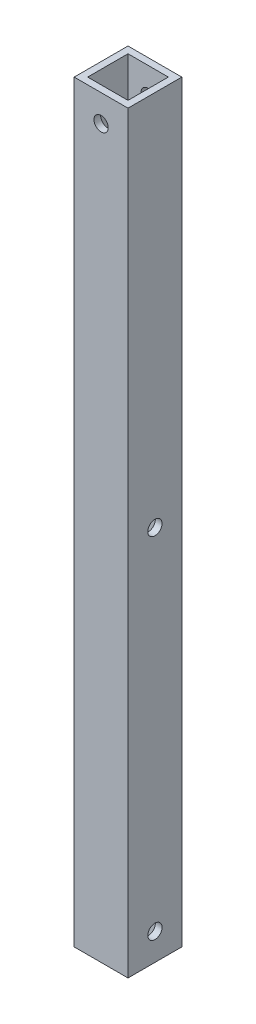
ISO-10303-21;
HEADER;
FILE_DESCRIPTION(('STEP AP214'),'2;1');
FILE_NAME('part.step','',(''),(''),'','','');
FILE_SCHEMA(('AUTOMOTIVE_DESIGN { 1 0 10303 214 1 1 1 1 }'));
ENDSEC;
DATA;
#1=APPLICATION_CONTEXT('core data for automotive mechanical design processes');
#2=APPLICATION_PROTOCOL_DEFINITION('international standard','automotive_design',2000,#1);
#3=PRODUCT_CONTEXT('',#1,'mechanical');
#4=PRODUCT('Part','Part','',(#3));
#5=PRODUCT_RELATED_PRODUCT_CATEGORY('part','',(#4));
#6=PRODUCT_DEFINITION_FORMATION('','',#4);
#7=PRODUCT_DEFINITION_CONTEXT('part definition',#1,'design');
#8=PRODUCT_DEFINITION('design','',#6,#7);
#9=PRODUCT_DEFINITION_SHAPE('','',#8);
#10=(LENGTH_UNIT() NAMED_UNIT(*) SI_UNIT(.MILLI.,.METRE.));
#11=(NAMED_UNIT(*) PLANE_ANGLE_UNIT() SI_UNIT($,.RADIAN.));
#12=(NAMED_UNIT(*) SI_UNIT($,.STERADIAN.) SOLID_ANGLE_UNIT());
#13=UNCERTAINTY_MEASURE_WITH_UNIT(LENGTH_MEASURE(1.E-05),#10,'distance_accuracy_value','');
#14=(GEOMETRIC_REPRESENTATION_CONTEXT(3) GLOBAL_UNCERTAINTY_ASSIGNED_CONTEXT((#13)) GLOBAL_UNIT_ASSIGNED_CONTEXT((#10,
#11,#12)) REPRESENTATION_CONTEXT('',''));
#15=CARTESIAN_POINT('',(0.,0.,0.));
#16=DIRECTION('',(0.,0.,1.));
#17=DIRECTION('',(1.,0.,0.));
#18=AXIS2_PLACEMENT_3D('',#15,#16,#17);
#19=CARTESIAN_POINT('',(0.,355.6,0.));
#20=DIRECTION('',(0.,-1.,0.));
#21=DIRECTION('',(0.,0.,-1.));
#22=AXIS2_PLACEMENT_3D('',#19,#20,#21);
#23=PLANE('',#22);
#24=DIRECTION('',(0.,0.,1.));
#25=VECTOR('',#24,1.);
#26=CARTESIAN_POINT('',(0.,355.6,0.));
#27=LINE('',#26,#25);
#28=CARTESIAN_POINT('',(0.,355.6,-25.4));
#29=VERTEX_POINT('',#28);
#30=CARTESIAN_POINT('',(0.,355.6,0.));
#31=VERTEX_POINT('',#30);
#32=EDGE_CURVE('E142',#29,#31,#27,.T.);
#33=ORIENTED_EDGE('',*,*,#32,.T.);
#34=DIRECTION('',(1.,0.,0.));
#35=VECTOR('',#34,1.);
#36=CARTESIAN_POINT('',(0.,355.6,0.));
#37=LINE('',#36,#35);
#38=CARTESIAN_POINT('',(25.4,355.6,0.));
#39=VERTEX_POINT('',#38);
#40=EDGE_CURVE('E145',#31,#39,#37,.T.);
#41=ORIENTED_EDGE('',*,*,#40,.T.);
#42=DIRECTION('',(0.,0.,-1.));
#43=VECTOR('',#42,1.);
#44=CARTESIAN_POINT('',(25.4,355.6,0.));
#45=LINE('',#44,#43);
#46=CARTESIAN_POINT('',(25.4,355.6,-25.4));
#47=VERTEX_POINT('',#46);
#48=EDGE_CURVE('E148',#39,#47,#45,.T.);
#49=ORIENTED_EDGE('',*,*,#48,.T.);
#50=DIRECTION('',(-1.,0.,0.));
#51=VECTOR('',#50,1.);
#52=CARTESIAN_POINT('',(0.,355.6,-25.4));
#53=LINE('',#52,#51);
#54=EDGE_CURVE('E150',#47,#29,#53,.T.);
#55=ORIENTED_EDGE('',*,*,#54,.T.);
#56=EDGE_LOOP('',(#33,#41,#49,#55));
#57=FACE_BOUND('',#56,.T.);
#58=DIRECTION('',(0.,0.,1.));
#59=VECTOR('',#58,1.);
#60=CARTESIAN_POINT('',(3.175,355.6,-3.175));
#61=LINE('',#60,#59);
#62=CARTESIAN_POINT('',(3.175,355.6,-22.225));
#63=VERTEX_POINT('',#62);
#64=CARTESIAN_POINT('',(3.175,355.6,-3.175));
#65=VERTEX_POINT('',#64);
#66=EDGE_CURVE('E104',#63,#65,#61,.T.);
#67=ORIENTED_EDGE('',*,*,#66,.F.);
#68=DIRECTION('',(-1.,0.,0.));
#69=VECTOR('',#68,1.);
#70=CARTESIAN_POINT('',(3.175,355.6,-22.225));
#71=LINE('',#70,#69);
#72=CARTESIAN_POINT('',(22.225,355.6,-22.225));
#73=VERTEX_POINT('',#72);
#74=EDGE_CURVE('E126',#73,#63,#71,.T.);
#75=ORIENTED_EDGE('',*,*,#74,.F.);
#76=DIRECTION('',(0.,0.,-1.));
#77=VECTOR('',#76,1.);
#78=CARTESIAN_POINT('',(22.225,355.6,-3.175));
#79=LINE('',#78,#77);
#80=CARTESIAN_POINT('',(22.225,355.6,-3.175));
#81=VERTEX_POINT('',#80);
#82=EDGE_CURVE('E124',#81,#73,#79,.T.);
#83=ORIENTED_EDGE('',*,*,#82,.F.);
#84=DIRECTION('',(1.,0.,0.));
#85=VECTOR('',#84,1.);
#86=CARTESIAN_POINT('',(3.175,355.6,-3.175));
#87=LINE('',#86,#85);
#88=EDGE_CURVE('E112',#65,#81,#87,.T.);
#89=ORIENTED_EDGE('',*,*,#88,.F.);
#90=EDGE_LOOP('',(#67,#75,#83,#89));
#91=FACE_BOUND('',#90,.T.);
#92=ADVANCED_FACE('F37',(#57,#91),#23,.F.);
#93=CARTESIAN_POINT('',(0.,0.,0.));
#94=DIRECTION('',(0.,-1.,0.));
#95=DIRECTION('',(0.,0.,-1.));
#96=AXIS2_PLACEMENT_3D('',#93,#94,#95);
#97=PLANE('',#96);
#98=DIRECTION('',(0.,0.,1.));
#99=VECTOR('',#98,1.);
#100=CARTESIAN_POINT('',(0.,0.,0.));
#101=LINE('',#100,#99);
#102=CARTESIAN_POINT('',(0.,0.,-25.4));
#103=VERTEX_POINT('',#102);
#104=CARTESIAN_POINT('',(0.,0.,0.));
#105=VERTEX_POINT('',#104);
#106=EDGE_CURVE('E120',#103,#105,#101,.T.);
#107=ORIENTED_EDGE('',*,*,#106,.F.);
#108=DIRECTION('',(-1.,0.,0.));
#109=VECTOR('',#108,1.);
#110=CARTESIAN_POINT('',(0.,0.,-25.4));
#111=LINE('',#110,#109);
#112=CARTESIAN_POINT('',(25.4,0.,-25.4));
#113=VERTEX_POINT('',#112);
#114=EDGE_CURVE('E146',#113,#103,#111,.T.);
#115=ORIENTED_EDGE('',*,*,#114,.F.);
#116=DIRECTION('',(0.,0.,-1.));
#117=VECTOR('',#116,1.);
#118=CARTESIAN_POINT('',(25.4,0.,0.));
#119=LINE('',#118,#117);
#120=CARTESIAN_POINT('',(25.4,0.,0.));
#121=VERTEX_POINT('',#120);
#122=EDGE_CURVE('E157',#121,#113,#119,.T.);
#123=ORIENTED_EDGE('',*,*,#122,.F.);
#124=DIRECTION('',(1.,0.,0.));
#125=VECTOR('',#124,1.);
#126=CARTESIAN_POINT('',(0.,0.,0.));
#127=LINE('',#126,#125);
#128=EDGE_CURVE('E155',#105,#121,#127,.T.);
#129=ORIENTED_EDGE('',*,*,#128,.F.);
#130=EDGE_LOOP('',(#107,#115,#123,#129));
#131=FACE_BOUND('',#130,.T.);
#132=DIRECTION('',(-1.,0.,0.));
#133=VECTOR('',#132,1.);
#134=CARTESIAN_POINT('',(3.175,0.,-22.225));
#135=LINE('',#134,#133);
#136=CARTESIAN_POINT('',(22.225,0.,-22.225));
#137=VERTEX_POINT('',#136);
#138=CARTESIAN_POINT('',(3.175,0.,-22.225));
#139=VERTEX_POINT('',#138);
#140=EDGE_CURVE('E113',#137,#139,#135,.T.);
#141=ORIENTED_EDGE('',*,*,#140,.T.);
#142=DIRECTION('',(0.,0.,1.));
#143=VECTOR('',#142,1.);
#144=CARTESIAN_POINT('',(3.175,0.,-3.175));
#145=LINE('',#144,#143);
#146=CARTESIAN_POINT('',(3.175,0.,-3.175));
#147=VERTEX_POINT('',#146);
#148=EDGE_CURVE('E62',#139,#147,#145,.T.);
#149=ORIENTED_EDGE('',*,*,#148,.T.);
#150=DIRECTION('',(1.,0.,0.));
#151=VECTOR('',#150,1.);
#152=CARTESIAN_POINT('',(3.175,0.,-3.175));
#153=LINE('',#152,#151);
#154=CARTESIAN_POINT('',(22.225,0.,-3.175));
#155=VERTEX_POINT('',#154);
#156=EDGE_CURVE('E119',#147,#155,#153,.T.);
#157=ORIENTED_EDGE('',*,*,#156,.T.);
#158=DIRECTION('',(0.,0.,-1.));
#159=VECTOR('',#158,1.);
#160=CARTESIAN_POINT('',(22.225,0.,-3.175));
#161=LINE('',#160,#159);
#162=EDGE_CURVE('E134',#155,#137,#161,.T.);
#163=ORIENTED_EDGE('',*,*,#162,.T.);
#164=EDGE_LOOP('',(#141,#149,#157,#163));
#165=FACE_BOUND('',#164,.T.);
#166=ADVANCED_FACE('F216',(#131,#165),#97,.T.);
#167=CARTESIAN_POINT('',(0.,355.6,0.));
#168=DIRECTION('',(1.,0.,0.));
#169=DIRECTION('',(0.,0.,-1.));
#170=AXIS2_PLACEMENT_3D('',#167,#168,#169);
#171=PLANE('',#170);
#172=CARTESIAN_POINT('',(0.,177.8,-12.7));
#173=DIRECTION('',(1.,0.,0.));
#174=DIRECTION('',(0.,0.,-1.));
#175=AXIS2_PLACEMENT_3D('',#172,#173,#174);
#176=CIRCLE('',#175,3.3734375);
#177=CARTESIAN_POINT('',(0.,177.8,-16.0734375));
#178=VERTEX_POINT('',#177);
#179=EDGE_CURVE('E173',#178,#178,#176,.T.);
#180=ORIENTED_EDGE('',*,*,#179,.T.);
#181=EDGE_LOOP('',(#180));
#182=FACE_BOUND('',#181,.T.);
#183=CARTESIAN_POINT('',(0.,12.7,-12.7));
#184=DIRECTION('',(1.,0.,0.));
#185=DIRECTION('',(0.,0.,-1.));
#186=AXIS2_PLACEMENT_3D('',#183,#184,#185);
#187=CIRCLE('',#186,3.3734375);
#188=CARTESIAN_POINT('',(0.,12.7,-16.0734375));
#189=VERTEX_POINT('',#188);
#190=EDGE_CURVE('E169',#189,#189,#187,.T.);
#191=ORIENTED_EDGE('',*,*,#190,.T.);
#192=EDGE_LOOP('',(#191));
#193=FACE_BOUND('',#192,.T.);
#194=ORIENTED_EDGE('',*,*,#106,.T.);
#195=DIRECTION('',(0.,-1.,0.));
#196=VECTOR('',#195,1.);
#197=CARTESIAN_POINT('',(0.,355.6,0.));
#198=LINE('',#197,#196);
#199=EDGE_CURVE('E11',#31,#105,#198,.T.);
#200=ORIENTED_EDGE('',*,*,#199,.F.);
#201=ORIENTED_EDGE('',*,*,#32,.F.);
#202=DIRECTION('',(0.,-1.,0.));
#203=VECTOR('',#202,1.);
#204=CARTESIAN_POINT('',(0.,355.6,-25.4));
#205=LINE('',#204,#203);
#206=EDGE_CURVE('E152',#29,#103,#205,.T.);
#207=ORIENTED_EDGE('',*,*,#206,.T.);
#208=EDGE_LOOP('',(#194,#200,#201,#207));
#209=FACE_BOUND('',#208,.T.);
#210=ADVANCED_FACE('F39',(#182,#193,#209),#171,.F.);
#211=CARTESIAN_POINT('',(0.,355.6,0.));
#212=DIRECTION('',(0.,0.,-1.));
#213=DIRECTION('',(-1.,0.,0.));
#214=AXIS2_PLACEMENT_3D('',#211,#212,#213);
#215=PLANE('',#214);
#216=CARTESIAN_POINT('',(12.7,342.9,0.));
#217=DIRECTION('',(0.,0.,1.));
#218=DIRECTION('',(1.,0.,0.));
#219=AXIS2_PLACEMENT_3D('',#216,#217,#218);
#220=CIRCLE('',#219,3.3734375);
#221=CARTESIAN_POINT('',(16.0734375,342.9,0.));
#222=VERTEX_POINT('',#221);
#223=EDGE_CURVE('E235',#222,#222,#220,.T.);
#224=ORIENTED_EDGE('',*,*,#223,.F.);
#225=EDGE_LOOP('',(#224));
#226=FACE_BOUND('',#225,.T.);
#227=ORIENTED_EDGE('',*,*,#128,.T.);
#228=DIRECTION('',(0.,-1.,0.));
#229=VECTOR('',#228,1.);
#230=CARTESIAN_POINT('',(25.4,355.6,0.));
#231=LINE('',#230,#229);
#232=EDGE_CURVE('E46',#39,#121,#231,.T.);
#233=ORIENTED_EDGE('',*,*,#232,.F.);
#234=ORIENTED_EDGE('',*,*,#40,.F.);
#235=ORIENTED_EDGE('',*,*,#199,.T.);
#236=EDGE_LOOP('',(#227,#233,#234,#235));
#237=FACE_BOUND('',#236,.T.);
#238=ADVANCED_FACE('F225',(#226,#237),#215,.F.);
#239=CARTESIAN_POINT('',(25.4,355.6,0.));
#240=DIRECTION('',(-1.,0.,0.));
#241=DIRECTION('',(0.,0.,1.));
#242=AXIS2_PLACEMENT_3D('',#239,#240,#241);
#243=PLANE('',#242);
#244=CARTESIAN_POINT('',(25.4,177.8,-12.7));
#245=DIRECTION('',(1.,0.,0.));
#246=DIRECTION('',(0.,0.,-1.));
#247=AXIS2_PLACEMENT_3D('',#244,#245,#246);
#248=CIRCLE('',#247,3.3734375);
#249=CARTESIAN_POINT('',(25.4,177.8,-16.0734375));
#250=VERTEX_POINT('',#249);
#251=EDGE_CURVE('E180',#250,#250,#248,.T.);
#252=ORIENTED_EDGE('',*,*,#251,.F.);
#253=EDGE_LOOP('',(#252));
#254=FACE_BOUND('',#253,.T.);
#255=CARTESIAN_POINT('',(25.4,12.7,-12.7));
#256=DIRECTION('',(1.,0.,0.));
#257=DIRECTION('',(0.,0.,-1.));
#258=AXIS2_PLACEMENT_3D('',#255,#256,#257);
#259=CIRCLE('',#258,3.3734375);
#260=CARTESIAN_POINT('',(25.4,12.7,-16.0734375));
#261=VERTEX_POINT('',#260);
#262=EDGE_CURVE('E177',#261,#261,#259,.T.);
#263=ORIENTED_EDGE('',*,*,#262,.F.);
#264=EDGE_LOOP('',(#263));
#265=FACE_BOUND('',#264,.T.);
#266=ORIENTED_EDGE('',*,*,#122,.T.);
#267=DIRECTION('',(0.,-1.,0.));
#268=VECTOR('',#267,1.);
#269=CARTESIAN_POINT('',(25.4,355.6,-25.4));
#270=LINE('',#269,#268);
#271=EDGE_CURVE('E162',#47,#113,#270,.T.);
#272=ORIENTED_EDGE('',*,*,#271,.F.);
#273=ORIENTED_EDGE('',*,*,#48,.F.);
#274=ORIENTED_EDGE('',*,*,#232,.T.);
#275=EDGE_LOOP('',(#266,#272,#273,#274));
#276=FACE_BOUND('',#275,.T.);
#277=ADVANCED_FACE('F210',(#254,#265,#276),#243,.F.);
#278=CARTESIAN_POINT('',(0.,355.6,-25.4));
#279=DIRECTION('',(0.,0.,1.));
#280=DIRECTION('',(1.,0.,0.));
#281=AXIS2_PLACEMENT_3D('',#278,#279,#280);
#282=PLANE('',#281);
#283=CARTESIAN_POINT('',(12.7,342.9,-25.4));
#284=DIRECTION('',(0.,0.,1.));
#285=DIRECTION('',(1.,0.,0.));
#286=AXIS2_PLACEMENT_3D('',#283,#284,#285);
#287=CIRCLE('',#286,3.3734375);
#288=CARTESIAN_POINT('',(16.0734375,342.9,-25.4));
#289=VERTEX_POINT('',#288);
#290=EDGE_CURVE('E284',#289,#289,#287,.T.);
#291=ORIENTED_EDGE('',*,*,#290,.T.);
#292=EDGE_LOOP('',(#291));
#293=FACE_BOUND('',#292,.T.);
#294=ORIENTED_EDGE('',*,*,#114,.T.);
#295=ORIENTED_EDGE('',*,*,#206,.F.);
#296=ORIENTED_EDGE('',*,*,#54,.F.);
#297=ORIENTED_EDGE('',*,*,#271,.T.);
#298=EDGE_LOOP('',(#294,#295,#296,#297));
#299=FACE_BOUND('',#298,.T.);
#300=ADVANCED_FACE('F200',(#293,#299),#282,.F.);
#301=CARTESIAN_POINT('',(3.175,355.6,-3.175));
#302=DIRECTION('',(1.,0.,0.));
#303=DIRECTION('',(0.,0.,-1.));
#304=AXIS2_PLACEMENT_3D('',#301,#302,#303);
#305=PLANE('',#304);
#306=CARTESIAN_POINT('',(3.175,177.8,-12.7));
#307=DIRECTION('',(1.,0.,0.));
#308=DIRECTION('',(0.,0.,-1.));
#309=AXIS2_PLACEMENT_3D('',#306,#307,#308);
#310=CIRCLE('',#309,3.3734375);
#311=CARTESIAN_POINT('',(3.175,177.8,-16.0734375));
#312=VERTEX_POINT('',#311);
#313=EDGE_CURVE('E172',#312,#312,#310,.T.);
#314=ORIENTED_EDGE('',*,*,#313,.F.);
#315=EDGE_LOOP('',(#314));
#316=FACE_BOUND('',#315,.T.);
#317=CARTESIAN_POINT('',(3.175,12.7,-12.7));
#318=DIRECTION('',(1.,0.,0.));
#319=DIRECTION('',(0.,0.,-1.));
#320=AXIS2_PLACEMENT_3D('',#317,#318,#319);
#321=CIRCLE('',#320,3.3734375);
#322=CARTESIAN_POINT('',(3.175,12.7,-16.0734375));
#323=VERTEX_POINT('',#322);
#324=EDGE_CURVE('E132',#323,#323,#321,.T.);
#325=ORIENTED_EDGE('',*,*,#324,.F.);
#326=EDGE_LOOP('',(#325));
#327=FACE_BOUND('',#326,.T.);
#328=ORIENTED_EDGE('',*,*,#148,.F.);
#329=DIRECTION('',(0.,-1.,0.));
#330=VECTOR('',#329,1.);
#331=CARTESIAN_POINT('',(3.175,355.6,-22.225));
#332=LINE('',#331,#330);
#333=EDGE_CURVE('E108',#63,#139,#332,.T.);
#334=ORIENTED_EDGE('',*,*,#333,.F.);
#335=ORIENTED_EDGE('',*,*,#66,.T.);
#336=DIRECTION('',(0.,-1.,0.));
#337=VECTOR('',#336,1.);
#338=CARTESIAN_POINT('',(3.175,355.6,-3.175));
#339=LINE('',#338,#337);
#340=EDGE_CURVE('E107',#65,#147,#339,.T.);
#341=ORIENTED_EDGE('',*,*,#340,.T.);
#342=EDGE_LOOP('',(#328,#334,#335,#341));
#343=FACE_BOUND('',#342,.T.);
#344=ADVANCED_FACE('F106',(#316,#327,#343),#305,.T.);
#345=CARTESIAN_POINT('',(3.175,355.6,-3.175));
#346=DIRECTION('',(0.,0.,-1.));
#347=DIRECTION('',(-1.,0.,0.));
#348=AXIS2_PLACEMENT_3D('',#345,#346,#347);
#349=PLANE('',#348);
#350=CARTESIAN_POINT('',(12.7,342.9,-3.175));
#351=DIRECTION('',(0.,0.,-1.));
#352=DIRECTION('',(-1.,0.,0.));
#353=AXIS2_PLACEMENT_3D('',#350,#351,#352);
#354=CIRCLE('',#353,3.3734375);
#355=CARTESIAN_POINT('',(9.32656249999999,342.9,-3.175));
#356=VERTEX_POINT('',#355);
#357=EDGE_CURVE('E185',#356,#356,#354,.T.);
#358=ORIENTED_EDGE('',*,*,#357,.F.);
#359=EDGE_LOOP('',(#358));
#360=FACE_BOUND('',#359,.T.);
#361=ORIENTED_EDGE('',*,*,#156,.F.);
#362=ORIENTED_EDGE('',*,*,#340,.F.);
#363=ORIENTED_EDGE('',*,*,#88,.T.);
#364=DIRECTION('',(0.,-1.,0.));
#365=VECTOR('',#364,1.);
#366=CARTESIAN_POINT('',(22.225,355.6,-3.175));
#367=LINE('',#366,#365);
#368=EDGE_CURVE('E121',#81,#155,#367,.T.);
#369=ORIENTED_EDGE('',*,*,#368,.T.);
#370=EDGE_LOOP('',(#361,#362,#363,#369));
#371=FACE_BOUND('',#370,.T.);
#372=ADVANCED_FACE('F116',(#360,#371),#349,.T.);
#373=CARTESIAN_POINT('',(22.225,355.6,-3.175));
#374=DIRECTION('',(-1.,0.,0.));
#375=DIRECTION('',(0.,0.,1.));
#376=AXIS2_PLACEMENT_3D('',#373,#374,#375);
#377=PLANE('',#376);
#378=CARTESIAN_POINT('',(22.225,177.8,-12.7));
#379=DIRECTION('',(-1.,0.,0.));
#380=DIRECTION('',(0.,0.,1.));
#381=AXIS2_PLACEMENT_3D('',#378,#379,#380);
#382=CIRCLE('',#381,3.3734375);
#383=CARTESIAN_POINT('',(22.225,177.8,-9.3265625));
#384=VERTEX_POINT('',#383);
#385=EDGE_CURVE('E170',#384,#384,#382,.T.);
#386=ORIENTED_EDGE('',*,*,#385,.F.);
#387=EDGE_LOOP('',(#386));
#388=FACE_BOUND('',#387,.T.);
#389=CARTESIAN_POINT('',(22.225,12.7,-12.7));
#390=DIRECTION('',(-1.,0.,0.));
#391=DIRECTION('',(0.,0.,1.));
#392=AXIS2_PLACEMENT_3D('',#389,#390,#391);
#393=CIRCLE('',#392,3.3734375);
#394=CARTESIAN_POINT('',(22.225,12.7,-9.3265625));
#395=VERTEX_POINT('',#394);
#396=EDGE_CURVE('E167',#395,#395,#393,.T.);
#397=ORIENTED_EDGE('',*,*,#396,.F.);
#398=EDGE_LOOP('',(#397));
#399=FACE_BOUND('',#398,.T.);
#400=ORIENTED_EDGE('',*,*,#162,.F.);
#401=ORIENTED_EDGE('',*,*,#368,.F.);
#402=ORIENTED_EDGE('',*,*,#82,.T.);
#403=DIRECTION('',(0.,-1.,0.));
#404=VECTOR('',#403,1.);
#405=CARTESIAN_POINT('',(22.225,355.6,-22.225));
#406=LINE('',#405,#404);
#407=EDGE_CURVE('E54',#73,#137,#406,.T.);
#408=ORIENTED_EDGE('',*,*,#407,.T.);
#409=EDGE_LOOP('',(#400,#401,#402,#408));
#410=FACE_BOUND('',#409,.T.);
#411=ADVANCED_FACE('F207',(#388,#399,#410),#377,.T.);
#412=CARTESIAN_POINT('',(3.175,355.6,-22.225));
#413=DIRECTION('',(0.,0.,1.));
#414=DIRECTION('',(1.,0.,0.));
#415=AXIS2_PLACEMENT_3D('',#412,#413,#414);
#416=PLANE('',#415);
#417=CARTESIAN_POINT('',(12.7,342.9,-22.225));
#418=DIRECTION('',(0.,0.,1.));
#419=DIRECTION('',(1.,0.,0.));
#420=AXIS2_PLACEMENT_3D('',#417,#418,#419);
#421=CIRCLE('',#420,3.3734375);
#422=CARTESIAN_POINT('',(16.0734375,342.9,-22.225));
#423=VERTEX_POINT('',#422);
#424=EDGE_CURVE('E41',#423,#423,#421,.T.);
#425=ORIENTED_EDGE('',*,*,#424,.F.);
#426=EDGE_LOOP('',(#425));
#427=FACE_BOUND('',#426,.T.);
#428=ORIENTED_EDGE('',*,*,#140,.F.);
#429=ORIENTED_EDGE('',*,*,#407,.F.);
#430=ORIENTED_EDGE('',*,*,#74,.T.);
#431=ORIENTED_EDGE('',*,*,#333,.T.);
#432=EDGE_LOOP('',(#428,#429,#430,#431));
#433=FACE_BOUND('',#432,.T.);
#434=ADVANCED_FACE('F251',(#427,#433),#416,.T.);
#435=CARTESIAN_POINT('',(0.,12.7,-12.7));
#436=DIRECTION('',(1.,0.,0.));
#437=DIRECTION('',(0.,0.,-1.));
#438=AXIS2_PLACEMENT_3D('',#435,#436,#437);
#439=CYLINDRICAL_SURFACE('',#438,3.3734375);
#440=ORIENTED_EDGE('',*,*,#396,.T.);
#441=EDGE_LOOP('',(#440));
#442=FACE_BOUND('',#441,.T.);
#443=ORIENTED_EDGE('',*,*,#262,.T.);
#444=EDGE_LOOP('',(#443));
#445=FACE_BOUND('',#444,.T.);
#446=ADVANCED_FACE('F253',(#442,#445),#439,.F.);
#447=ORIENTED_EDGE('',*,*,#324,.T.);
#448=EDGE_LOOP('',(#447));
#449=FACE_BOUND('',#448,.T.);
#450=ORIENTED_EDGE('',*,*,#190,.F.);
#451=EDGE_LOOP('',(#450));
#452=FACE_BOUND('',#451,.T.);
#453=ADVANCED_FACE('F196',(#449,#452),#439,.F.);
#454=CARTESIAN_POINT('',(0.,177.8,-12.7));
#455=DIRECTION('',(1.,0.,0.));
#456=DIRECTION('',(0.,0.,-1.));
#457=AXIS2_PLACEMENT_3D('',#454,#455,#456);
#458=CYLINDRICAL_SURFACE('',#457,3.3734375);
#459=ORIENTED_EDGE('',*,*,#385,.T.);
#460=EDGE_LOOP('',(#459));
#461=FACE_BOUND('',#460,.T.);
#462=ORIENTED_EDGE('',*,*,#251,.T.);
#463=EDGE_LOOP('',(#462));
#464=FACE_BOUND('',#463,.T.);
#465=ADVANCED_FACE('F266',(#461,#464),#458,.F.);
#466=ORIENTED_EDGE('',*,*,#313,.T.);
#467=EDGE_LOOP('',(#466));
#468=FACE_BOUND('',#467,.T.);
#469=ORIENTED_EDGE('',*,*,#179,.F.);
#470=EDGE_LOOP('',(#469));
#471=FACE_BOUND('',#470,.T.);
#472=ADVANCED_FACE('F269',(#468,#471),#458,.F.);
#473=CARTESIAN_POINT('',(12.7,342.9,-25.4));
#474=DIRECTION('',(0.,0.,1.));
#475=DIRECTION('',(1.,0.,0.));
#476=AXIS2_PLACEMENT_3D('',#473,#474,#475);
#477=CYLINDRICAL_SURFACE('',#476,3.3734375);
#478=ORIENTED_EDGE('',*,*,#424,.T.);
#479=EDGE_LOOP('',(#478));
#480=FACE_BOUND('',#479,.T.);
#481=ORIENTED_EDGE('',*,*,#290,.F.);
#482=EDGE_LOOP('',(#481));
#483=FACE_BOUND('',#482,.T.);
#484=ADVANCED_FACE('F270',(#480,#483),#477,.F.);
#485=ORIENTED_EDGE('',*,*,#357,.T.);
#486=EDGE_LOOP('',(#485));
#487=FACE_BOUND('',#486,.T.);
#488=ORIENTED_EDGE('',*,*,#223,.T.);
#489=EDGE_LOOP('',(#488));
#490=FACE_BOUND('',#489,.T.);
#491=ADVANCED_FACE('F272',(#487,#490),#477,.F.);
#492=CLOSED_SHELL('',(#92,#166,#210,#238,#277,#300,#344,#372,#411,#434,#446,#453,#465,#472,#484,#491));
#493=MANIFOLD_SOLID_BREP('B2',#492);
#494=ADVANCED_BREP_SHAPE_REPRESENTATION('',(#18,#493),#14);
#495=SHAPE_DEFINITION_REPRESENTATION(#9,#494);
ENDSEC;
END-ISO-10303-21;
